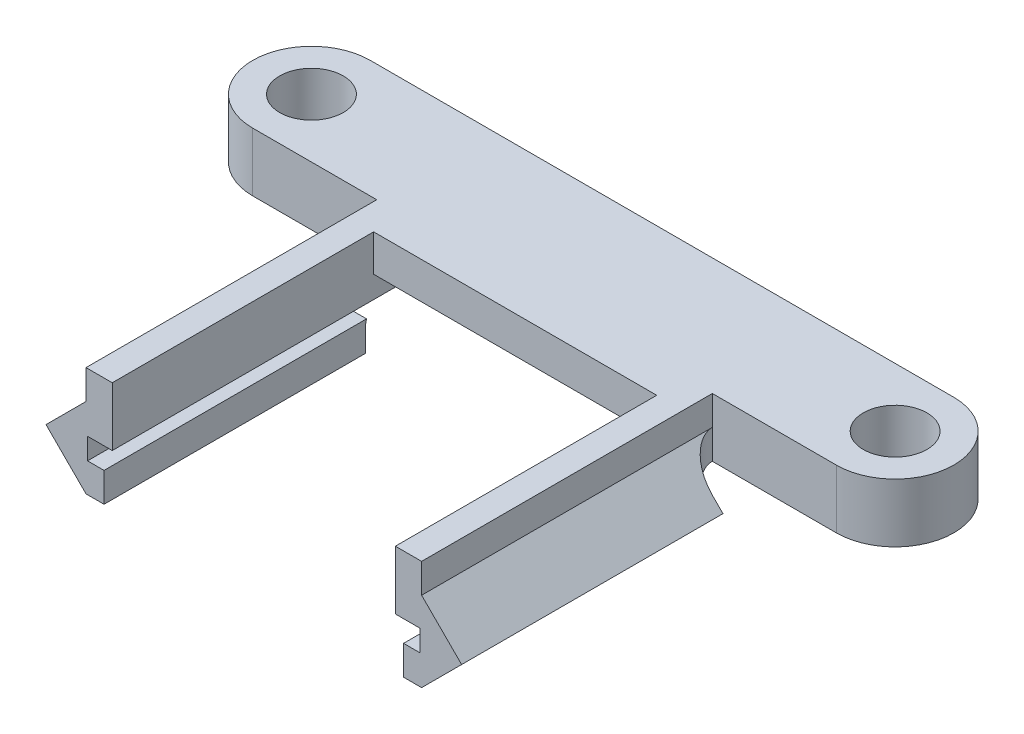
ISO-10303-21;
HEADER;
FILE_DESCRIPTION(('STEP AP214'),'2;1');
FILE_NAME('part.step','',(''),(''),'','','');
FILE_SCHEMA(('AUTOMOTIVE_DESIGN { 1 0 10303 214 1 1 1 1 }'));
ENDSEC;
DATA;
#1=APPLICATION_CONTEXT('core data for automotive mechanical design processes');
#2=APPLICATION_PROTOCOL_DEFINITION('international standard','automotive_design',2000,#1);
#3=PRODUCT_CONTEXT('',#1,'mechanical');
#4=PRODUCT('Part','Part','',(#3));
#5=PRODUCT_RELATED_PRODUCT_CATEGORY('part','',(#4));
#6=PRODUCT_DEFINITION_FORMATION('','',#4);
#7=PRODUCT_DEFINITION_CONTEXT('part definition',#1,'design');
#8=PRODUCT_DEFINITION('design','',#6,#7);
#9=PRODUCT_DEFINITION_SHAPE('','',#8);
#10=(LENGTH_UNIT() NAMED_UNIT(*) SI_UNIT(.MILLI.,.METRE.));
#11=(NAMED_UNIT(*) PLANE_ANGLE_UNIT() SI_UNIT($,.RADIAN.));
#12=(NAMED_UNIT(*) SI_UNIT($,.STERADIAN.) SOLID_ANGLE_UNIT());
#13=UNCERTAINTY_MEASURE_WITH_UNIT(LENGTH_MEASURE(1.E-05),#10,'distance_accuracy_value','');
#14=(GEOMETRIC_REPRESENTATION_CONTEXT(3) GLOBAL_UNCERTAINTY_ASSIGNED_CONTEXT((#13)) GLOBAL_UNIT_ASSIGNED_CONTEXT((#10,
#11,#12)) REPRESENTATION_CONTEXT('',''));
#15=CARTESIAN_POINT('',(0.,0.,0.));
#16=DIRECTION('',(0.,0.,1.));
#17=DIRECTION('',(1.,0.,0.));
#18=AXIS2_PLACEMENT_3D('',#15,#16,#17);
#19=CARTESIAN_POINT('',(0.,1.8415,22.606));
#20=DIRECTION('',(0.,-1.,0.));
#21=DIRECTION('',(0.,0.,-1.));
#22=AXIS2_PLACEMENT_3D('',#19,#20,#21);
#23=PLANE('',#22);
#24=DIRECTION('',(0.,0.,-1.));
#25=VECTOR('',#24,1.);
#26=CARTESIAN_POINT('',(25.7048,1.8415,22.606));
#27=LINE('',#26,#25);
#28=CARTESIAN_POINT('',(25.7048,1.8415,22.606));
#29=VERTEX_POINT('',#28);
#30=CARTESIAN_POINT('',(25.7048,1.8415,-12.7));
#31=VERTEX_POINT('',#30);
#32=EDGE_CURVE('E356',#29,#31,#27,.T.);
#33=ORIENTED_EDGE('',*,*,#32,.T.);
#34=DIRECTION('',(-1.,0.,0.));
#35=VECTOR('',#34,1.);
#36=CARTESIAN_POINT('',(27.84475,1.8415,-12.7));
#37=LINE('',#36,#35);
#38=CARTESIAN_POINT('',(38.70198,1.8415,-12.7));
#39=VERTEX_POINT('',#38);
#40=EDGE_CURVE('E367',#39,#31,#37,.T.);
#41=ORIENTED_EDGE('',*,*,#40,.F.);
#42=CARTESIAN_POINT('',(38.70198,1.8415,-7.61999999999999));
#43=DIRECTION('',(0.,-1.,0.));
#44=DIRECTION('',(0.,0.,-1.));
#45=AXIS2_PLACEMENT_3D('',#42,#43,#44);
#46=CIRCLE('',#45,5.07999999999999);
#47=CARTESIAN_POINT('',(38.70198,1.8415,-2.54));
#48=VERTEX_POINT('',#47);
#49=EDGE_CURVE('E335',#39,#48,#46,.T.);
#50=ORIENTED_EDGE('',*,*,#49,.T.);
#51=DIRECTION('',(-1.,0.,0.));
#52=VECTOR('',#51,1.);
#53=CARTESIAN_POINT('',(27.9761024484277,1.8415,-2.54));
#54=LINE('',#53,#52);
#55=CARTESIAN_POINT('',(27.9761024484277,1.8415,-2.54));
#56=VERTEX_POINT('',#55);
#57=EDGE_CURVE('E257',#48,#56,#54,.T.);
#58=ORIENTED_EDGE('',*,*,#57,.T.);
#59=DIRECTION('',(-1.,0.,0.));
#60=VECTOR('',#59,1.);
#61=CARTESIAN_POINT('',(27.84475,1.8415,-2.54));
#62=LINE('',#61,#60);
#63=CARTESIAN_POINT('',(27.84475,1.8415,-2.53999999999999));
#64=VERTEX_POINT('',#63);
#65=EDGE_CURVE('E449',#56,#64,#62,.T.);
#66=ORIENTED_EDGE('',*,*,#65,.T.);
#67=DIRECTION('',(0.,0.,-1.));
#68=VECTOR('',#67,1.);
#69=CARTESIAN_POINT('',(27.84475,1.8415,22.606));
#70=LINE('',#69,#68);
#71=CARTESIAN_POINT('',(27.84475,1.8415,22.606));
#72=VERTEX_POINT('',#71);
#73=EDGE_CURVE('E403',#72,#64,#70,.T.);
#74=ORIENTED_EDGE('',*,*,#73,.F.);
#75=DIRECTION('',(-1.,0.,0.));
#76=VECTOR('',#75,1.);
#77=CARTESIAN_POINT('',(26.924,1.8415,22.606));
#78=LINE('',#77,#76);
#79=EDGE_CURVE('E394',#72,#29,#78,.T.);
#80=ORIENTED_EDGE('',*,*,#79,.T.);
#81=EDGE_LOOP('',(#33,#41,#50,#58,#66,#74,#80));
#82=FACE_BOUND('',#81,.T.);
#83=CARTESIAN_POINT('',(38.70198,1.8415,-7.61999999999999));
#84=DIRECTION('',(0.,-1.,0.));
#85=DIRECTION('',(0.,0.,-1.));
#86=AXIS2_PLACEMENT_3D('',#83,#84,#85);
#87=CIRCLE('',#86,2.75);
#88=CARTESIAN_POINT('',(38.70198,1.8415,-10.37));
#89=VERTEX_POINT('',#88);
#90=EDGE_CURVE('E316',#89,#89,#87,.T.);
#91=ORIENTED_EDGE('',*,*,#90,.F.);
#92=EDGE_LOOP('',(#91));
#93=FACE_BOUND('',#92,.T.);
#94=ADVANCED_FACE('F34',(#82,#93),#23,.T.);
#95=CARTESIAN_POINT('',(0.,0.,0.));
#96=DIRECTION('',(0.,0.,-1.));
#97=DIRECTION('',(-1.,0.,0.));
#98=AXIS2_PLACEMENT_3D('',#95,#96,#97);
#99=PLANE('',#98);
#100=DIRECTION('',(0.,1.,0.));
#101=VECTOR('',#100,1.);
#102=CARTESIAN_POINT('',(26.416,0.,0.));
#103=LINE('',#102,#101);
#104=CARTESIAN_POINT('',(26.416,-2.54,0.));
#105=VERTEX_POINT('',#104);
#106=CARTESIAN_POINT('',(26.416,-0.6985,0.));
#107=VERTEX_POINT('',#106);
#108=EDGE_CURVE('E373',#105,#107,#103,.T.);
#109=ORIENTED_EDGE('',*,*,#108,.T.);
#110=DIRECTION('',(-1.,0.,0.));
#111=VECTOR('',#110,1.);
#112=CARTESIAN_POINT('',(27.9761024484277,-0.6985,0.));
#113=LINE('',#112,#111);
#114=CARTESIAN_POINT('',(29.8176024484277,-0.6985,0.));
#115=VERTEX_POINT('',#114);
#116=EDGE_CURVE('E463',#107,#115,#113,.F.);
#117=ORIENTED_EDGE('',*,*,#116,.T.);
#118=DIRECTION('',(0.707106781186548,0.707106781186547,0.));
#119=VECTOR('',#118,1.);
#120=CARTESIAN_POINT('',(27.9761024484277,-2.54,0.));
#121=LINE('',#120,#119);
#122=CARTESIAN_POINT('',(27.9761024484277,-2.54,0.));
#123=VERTEX_POINT('',#122);
#124=EDGE_CURVE('E411',#123,#115,#121,.T.);
#125=ORIENTED_EDGE('',*,*,#124,.F.);
#126=DIRECTION('',(1.,0.,0.));
#127=VECTOR('',#126,1.);
#128=CARTESIAN_POINT('',(26.0985,-2.54,0.));
#129=LINE('',#128,#127);
#130=EDGE_CURVE('E426',#105,#123,#129,.T.);
#131=ORIENTED_EDGE('',*,*,#130,.F.);
#132=EDGE_LOOP('',(#109,#117,#125,#131));
#133=FACE_BOUND('',#132,.T.);
#134=ADVANCED_FACE('F541',(#133),#99,.T.);
#135=DIRECTION('',(0.707106781186548,-0.707106781186547,0.));
#136=VECTOR('',#135,1.);
#137=CARTESIAN_POINT('',(-1.05210244842766,-2.54,0.));
#138=LINE('',#137,#136);
#139=CARTESIAN_POINT('',(-2.89360244842766,-0.6985,0.));
#140=VERTEX_POINT('',#139);
#141=CARTESIAN_POINT('',(-1.05210244842766,-2.54,0.));
#142=VERTEX_POINT('',#141);
#143=EDGE_CURVE('E406',#140,#142,#138,.T.);
#144=ORIENTED_EDGE('',*,*,#143,.F.);
#145=DIRECTION('',(-1.,0.,0.));
#146=VECTOR('',#145,1.);
#147=CARTESIAN_POINT('',(-0.920750000000008,-0.6985,0.));
#148=LINE('',#147,#146);
#149=CARTESIAN_POINT('',(0.507999999999999,-0.6985,0.));
#150=VERTEX_POINT('',#149);
#151=EDGE_CURVE('E457',#140,#150,#148,.F.);
#152=ORIENTED_EDGE('',*,*,#151,.T.);
#153=DIRECTION('',(0.,-1.,0.));
#154=VECTOR('',#153,1.);
#155=CARTESIAN_POINT('',(0.508,0.,0.));
#156=LINE('',#155,#154);
#157=CARTESIAN_POINT('',(0.507999999999998,-2.54,0.));
#158=VERTEX_POINT('',#157);
#159=EDGE_CURVE('E371',#150,#158,#156,.T.);
#160=ORIENTED_EDGE('',*,*,#159,.T.);
#161=EDGE_CURVE('E427',#142,#158,#129,.T.);
#162=ORIENTED_EDGE('',*,*,#161,.F.);
#163=EDGE_LOOP('',(#144,#152,#160,#162));
#164=FACE_BOUND('',#163,.T.);
#165=ADVANCED_FACE('F627',(#164),#99,.T.);
#166=CARTESIAN_POINT('',(31.4368524484277,0.920749999999997,22.606));
#167=DIRECTION('',(-0.707106781186548,-0.707106781186547,0.));
#168=DIRECTION('',(0.707106781186547,-0.707106781186548,0.));
#169=AXIS2_PLACEMENT_3D('',#166,#167,#168);
#170=PLANE('',#169);
#171=DIRECTION('',(-0.707106781186547,0.707106781186548,0.));
#172=VECTOR('',#171,1.);
#173=CARTESIAN_POINT('',(27.9761024484277,4.3815,0.));
#174=LINE('',#173,#172);
#175=CARTESIAN_POINT('',(31.4368524484277,0.920749999999997,0.));
#176=VERTEX_POINT('',#175);
#177=CARTESIAN_POINT('',(30.5161024484277,1.8415,0.));
#178=VERTEX_POINT('',#177);
#179=EDGE_CURVE('E347',#176,#178,#174,.T.);
#180=ORIENTED_EDGE('',*,*,#179,.T.);
#181=CARTESIAN_POINT('',(30.5161024484277,1.8415,-2.54));
#182=DIRECTION('',(-0.707106781186548,-0.707106781186547,0.));
#183=DIRECTION('',(0.707106781186547,-0.707106781186548,0.));
#184=AXIS2_PLACEMENT_3D('',#181,#182,#183);
#185=ELLIPSE('',#184,3.59210244842766,2.54);
#186=CARTESIAN_POINT('',(27.9761024484277,4.3815,-2.54));
#187=VERTEX_POINT('',#186);
#188=EDGE_CURVE('E12',#178,#187,#185,.T.);
#189=ORIENTED_EDGE('',*,*,#188,.T.);
#190=DIRECTION('',(0.,0.,-1.));
#191=VECTOR('',#190,1.);
#192=CARTESIAN_POINT('',(27.9761024484277,4.3815,22.606));
#193=LINE('',#192,#191);
#194=CARTESIAN_POINT('',(27.9761024484277,4.3815,22.606));
#195=VERTEX_POINT('',#194);
#196=EDGE_CURVE('E438',#195,#187,#193,.T.);
#197=ORIENTED_EDGE('',*,*,#196,.F.);
#198=DIRECTION('',(-0.707106781186547,0.707106781186548,0.));
#199=VECTOR('',#198,1.);
#200=CARTESIAN_POINT('',(31.4368524484277,0.920749999999997,22.606));
#201=LINE('',#200,#199);
#202=CARTESIAN_POINT('',(31.4368524484277,0.920749999999997,22.606));
#203=VERTEX_POINT('',#202);
#204=EDGE_CURVE('E417',#203,#195,#201,.T.);
#205=ORIENTED_EDGE('',*,*,#204,.F.);
#206=DIRECTION('',(0.,0.,-1.));
#207=VECTOR('',#206,1.);
#208=CARTESIAN_POINT('',(31.4368524484277,0.920749999999997,22.606));
#209=LINE('',#208,#207);
#210=EDGE_CURVE('E440',#203,#176,#209,.T.);
#211=ORIENTED_EDGE('',*,*,#210,.T.);
#212=EDGE_LOOP('',(#180,#189,#197,#205,#211));
#213=FACE_BOUND('',#212,.T.);
#214=ADVANCED_FACE('F528',(#213),#170,.F.);
#215=CARTESIAN_POINT('',(-4.51285244842766,0.920749999999996,22.606));
#216=DIRECTION('',(0.707106781186548,-0.707106781186547,0.));
#217=DIRECTION('',(0.707106781186547,0.707106781186548,0.));
#218=AXIS2_PLACEMENT_3D('',#215,#216,#217);
#219=PLANE('',#218);
#220=DIRECTION('',(0.,0.,-1.));
#221=VECTOR('',#220,1.);
#222=CARTESIAN_POINT('',(-1.05210244842766,4.3815,22.606));
#223=LINE('',#222,#221);
#224=CARTESIAN_POINT('',(-1.05210244842766,4.3815,22.606));
#225=VERTEX_POINT('',#224);
#226=CARTESIAN_POINT('',(-1.05210244842767,4.3815,-2.53999999999999));
#227=VERTEX_POINT('',#226);
#228=EDGE_CURVE('E435',#225,#227,#223,.T.);
#229=ORIENTED_EDGE('',*,*,#228,.T.);
#230=CARTESIAN_POINT('',(-3.59210244842767,1.84149999999999,-2.54));
#231=DIRECTION('',(0.707106781186548,-0.707106781186547,0.));
#232=DIRECTION('',(0.707106781186547,0.707106781186548,0.));
#233=AXIS2_PLACEMENT_3D('',#230,#231,#232);
#234=ELLIPSE('',#233,3.59210244842766,2.54);
#235=CARTESIAN_POINT('',(-3.59210244842767,1.8415,0.));
#236=VERTEX_POINT('',#235);
#237=EDGE_CURVE('E479',#227,#236,#234,.T.);
#238=ORIENTED_EDGE('',*,*,#237,.T.);
#239=DIRECTION('',(-0.707106781186547,-0.707106781186548,0.));
#240=VECTOR('',#239,1.);
#241=CARTESIAN_POINT('',(-1.05210244842767,4.3815,0.));
#242=LINE('',#241,#240);
#243=CARTESIAN_POINT('',(-4.51285244842766,0.920750000000001,0.));
#244=VERTEX_POINT('',#243);
#245=EDGE_CURVE('E351',#236,#244,#242,.T.);
#246=ORIENTED_EDGE('',*,*,#245,.T.);
#247=DIRECTION('',(0.,0.,-1.));
#248=VECTOR('',#247,1.);
#249=CARTESIAN_POINT('',(-4.51285244842766,0.920749999999996,22.606));
#250=LINE('',#249,#248);
#251=CARTESIAN_POINT('',(-4.51285244842766,0.920749999999996,22.606));
#252=VERTEX_POINT('',#251);
#253=EDGE_CURVE('E422',#252,#244,#250,.T.);
#254=ORIENTED_EDGE('',*,*,#253,.F.);
#255=DIRECTION('',(-0.707106781186547,-0.707106781186548,0.));
#256=VECTOR('',#255,1.);
#257=CARTESIAN_POINT('',(-4.51285244842766,0.920749999999996,22.606));
#258=LINE('',#257,#256);
#259=EDGE_CURVE('E420',#225,#252,#258,.T.);
#260=ORIENTED_EDGE('',*,*,#259,.F.);
#261=EDGE_LOOP('',(#229,#238,#246,#254,#260));
#262=FACE_BOUND('',#261,.T.);
#263=ADVANCED_FACE('F579',(#262),#219,.F.);
#264=CARTESIAN_POINT('',(27.84475,1.8415,22.606));
#265=DIRECTION('',(-1.,0.,0.));
#266=DIRECTION('',(0.,0.,1.));
#267=AXIS2_PLACEMENT_3D('',#264,#265,#266);
#268=PLANE('',#267);
#269=ORIENTED_EDGE('',*,*,#73,.T.);
#270=CARTESIAN_POINT('',(27.84475,-0.6985,-2.54));
#271=DIRECTION('',(-1.,0.,0.));
#272=DIRECTION('',(0.,0.,1.));
#273=AXIS2_PLACEMENT_3D('',#270,#271,#272);
#274=CIRCLE('',#273,2.54);
#275=CARTESIAN_POINT('',(27.84475,0.,-0.0979316655752571));
#276=VERTEX_POINT('',#275);
#277=EDGE_CURVE('E483',#64,#276,#274,.F.);
#278=ORIENTED_EDGE('',*,*,#277,.T.);
#279=DIRECTION('',(0.,0.,-1.));
#280=VECTOR('',#279,1.);
#281=CARTESIAN_POINT('',(27.84475,0.,22.606));
#282=LINE('',#281,#280);
#283=CARTESIAN_POINT('',(27.84475,0.,22.606));
#284=VERTEX_POINT('',#283);
#285=EDGE_CURVE('E58',#284,#276,#282,.T.);
#286=ORIENTED_EDGE('',*,*,#285,.F.);
#287=DIRECTION('',(0.,1.,0.));
#288=VECTOR('',#287,1.);
#289=CARTESIAN_POINT('',(27.84475,1.8415,22.606));
#290=LINE('',#289,#288);
#291=EDGE_CURVE('E391',#284,#72,#290,.T.);
#292=ORIENTED_EDGE('',*,*,#291,.T.);
#293=EDGE_LOOP('',(#269,#278,#286,#292));
#294=FACE_BOUND('',#293,.T.);
#295=ADVANCED_FACE('F556',(#294),#268,.T.);
#296=CARTESIAN_POINT('',(-0.920750000000006,1.8415,22.606));
#297=DIRECTION('',(1.,0.,0.));
#298=DIRECTION('',(0.,0.,-1.));
#299=AXIS2_PLACEMENT_3D('',#296,#297,#298);
#300=PLANE('',#299);
#301=DIRECTION('',(0.,0.,-1.));
#302=VECTOR('',#301,1.);
#303=CARTESIAN_POINT('',(-0.920750000000006,0.,22.606));
#304=LINE('',#303,#302);
#305=CARTESIAN_POINT('',(-0.920750000000006,0.,22.606));
#306=VERTEX_POINT('',#305);
#307=CARTESIAN_POINT('',(-0.920750000000006,0.,-0.0979316655752571));
#308=VERTEX_POINT('',#307);
#309=EDGE_CURVE('E399',#306,#308,#304,.T.);
#310=ORIENTED_EDGE('',*,*,#309,.T.);
#311=CARTESIAN_POINT('',(-0.920750000000006,-0.6985,-2.54));
#312=DIRECTION('',(1.,0.,0.));
#313=DIRECTION('',(0.,0.,-1.));
#314=AXIS2_PLACEMENT_3D('',#311,#312,#313);
#315=CIRCLE('',#314,2.54);
#316=CARTESIAN_POINT('',(-0.920750000000006,1.8415,-2.53999999999999));
#317=VERTEX_POINT('',#316);
#318=EDGE_CURVE('E476',#308,#317,#315,.F.);
#319=ORIENTED_EDGE('',*,*,#318,.T.);
#320=DIRECTION('',(0.,0.,-1.));
#321=VECTOR('',#320,1.);
#322=CARTESIAN_POINT('',(-0.920750000000006,1.8415,22.606));
#323=LINE('',#322,#321);
#324=CARTESIAN_POINT('',(-0.920750000000006,1.8415,22.606));
#325=VERTEX_POINT('',#324);
#326=EDGE_CURVE('E401',#325,#317,#323,.T.);
#327=ORIENTED_EDGE('',*,*,#326,.F.);
#328=DIRECTION('',(0.,-1.,0.));
#329=VECTOR('',#328,1.);
#330=CARTESIAN_POINT('',(-0.920750000000006,1.8415,22.606));
#331=LINE('',#330,#329);
#332=EDGE_CURVE('E397',#325,#306,#331,.T.);
#333=ORIENTED_EDGE('',*,*,#332,.T.);
#334=EDGE_LOOP('',(#310,#319,#327,#333));
#335=FACE_BOUND('',#334,.T.);
#336=ADVANCED_FACE('F606',(#335),#300,.T.);
#337=CARTESIAN_POINT('',(0.,0.,22.606));
#338=DIRECTION('',(0.,0.,-1.));
#339=DIRECTION('',(-1.,0.,0.));
#340=AXIS2_PLACEMENT_3D('',#337,#338,#339);
#341=PLANE('',#340);
#342=CARTESIAN_POINT('',(1.2192,1.8415,22.606));
#343=VERTEX_POINT('',#342);
#344=EDGE_CURVE('E393',#343,#325,#78,.T.);
#345=ORIENTED_EDGE('',*,*,#344,.F.);
#346=DIRECTION('',(0.,1.,0.));
#347=VECTOR('',#346,1.);
#348=CARTESIAN_POINT('',(1.2192,1.8415,22.606));
#349=LINE('',#348,#347);
#350=CARTESIAN_POINT('',(1.2192,6.9215,22.606));
#351=VERTEX_POINT('',#350);
#352=EDGE_CURVE('E358',#343,#351,#349,.T.);
#353=ORIENTED_EDGE('',*,*,#352,.T.);
#354=DIRECTION('',(1.,0.,0.));
#355=VECTOR('',#354,1.);
#356=CARTESIAN_POINT('',(-1.05210244842766,6.9215,22.606));
#357=LINE('',#356,#355);
#358=CARTESIAN_POINT('',(-1.05210244842766,6.9215,22.606));
#359=VERTEX_POINT('',#358);
#360=EDGE_CURVE('E282',#359,#351,#357,.T.);
#361=ORIENTED_EDGE('',*,*,#360,.F.);
#362=DIRECTION('',(0.,-1.,0.));
#363=VECTOR('',#362,1.);
#364=CARTESIAN_POINT('',(-1.05210244842766,6.9215,22.606));
#365=LINE('',#364,#363);
#366=EDGE_CURVE('E309',#359,#225,#365,.T.);
#367=ORIENTED_EDGE('',*,*,#366,.T.);
#368=ORIENTED_EDGE('',*,*,#259,.T.);
#369=DIRECTION('',(0.707106781186548,-0.707106781186547,0.));
#370=VECTOR('',#369,1.);
#371=CARTESIAN_POINT('',(-1.05210244842766,-2.54,22.606));
#372=LINE('',#371,#370);
#373=CARTESIAN_POINT('',(-1.05210244842766,-2.54,22.606));
#374=VERTEX_POINT('',#373);
#375=EDGE_CURVE('E407',#252,#374,#372,.T.);
#376=ORIENTED_EDGE('',*,*,#375,.T.);
#377=DIRECTION('',(1.,0.,0.));
#378=VECTOR('',#377,1.);
#379=CARTESIAN_POINT('',(0.825500000000002,-2.54,22.606));
#380=LINE('',#379,#378);
#381=CARTESIAN_POINT('',(0.507999999999998,-2.54,22.606));
#382=VERTEX_POINT('',#381);
#383=EDGE_CURVE('E412',#374,#382,#380,.T.);
#384=ORIENTED_EDGE('',*,*,#383,.T.);
#385=DIRECTION('',(0.,-1.,0.));
#386=VECTOR('',#385,1.);
#387=CARTESIAN_POINT('',(0.508,0.,22.606));
#388=LINE('',#387,#386);
#389=CARTESIAN_POINT('',(0.508,0.,22.606));
#390=VERTEX_POINT('',#389);
#391=EDGE_CURVE('E370',#390,#382,#388,.T.);
#392=ORIENTED_EDGE('',*,*,#391,.F.);
#393=DIRECTION('',(1.,0.,0.));
#394=VECTOR('',#393,1.);
#395=CARTESIAN_POINT('',(-0.920750000000006,0.,22.606));
#396=LINE('',#395,#394);
#397=EDGE_CURVE('E388',#306,#390,#396,.T.);
#398=ORIENTED_EDGE('',*,*,#397,.F.);
#399=ORIENTED_EDGE('',*,*,#332,.F.);
#400=EDGE_LOOP('',(#345,#353,#361,#367,#368,#376,#384,#392,#398,#399));
#401=FACE_BOUND('',#400,.T.);
#402=ADVANCED_FACE('F587',(#401),#341,.F.);
#403=ORIENTED_EDGE('',*,*,#245,.F.);
#404=DIRECTION('',(0.,1.,0.));
#405=VECTOR('',#404,1.);
#406=CARTESIAN_POINT('',(-3.59210244842767,0.,0.));
#407=LINE('',#406,#405);
#408=CARTESIAN_POINT('',(-3.59210244842767,0.,0.));
#409=VERTEX_POINT('',#408);
#410=EDGE_CURVE('E455',#236,#409,#407,.F.);
#411=ORIENTED_EDGE('',*,*,#410,.T.);
#412=EDGE_CURVE('E423',#244,#409,#138,.T.);
#413=ORIENTED_EDGE('',*,*,#412,.F.);
#414=EDGE_LOOP('',(#403,#411,#413));
#415=FACE_BOUND('',#414,.T.);
#416=ADVANCED_FACE('F650',(#415),#99,.T.);
#417=CARTESIAN_POINT('',(26.0985,-2.54,22.606));
#418=DIRECTION('',(0.,1.,0.));
#419=DIRECTION('',(0.,0.,1.));
#420=AXIS2_PLACEMENT_3D('',#417,#418,#419);
#421=PLANE('',#420);
#422=ORIENTED_EDGE('',*,*,#161,.T.);
#423=DIRECTION('',(0.,0.,1.));
#424=VECTOR('',#423,1.);
#425=CARTESIAN_POINT('',(0.507999999999998,-2.54,0.));
#426=LINE('',#425,#424);
#427=EDGE_CURVE('E377',#158,#382,#426,.T.);
#428=ORIENTED_EDGE('',*,*,#427,.T.);
#429=ORIENTED_EDGE('',*,*,#383,.F.);
#430=DIRECTION('',(0.,0.,-1.));
#431=VECTOR('',#430,1.);
#432=CARTESIAN_POINT('',(-1.05210244842766,-2.54,22.606));
#433=LINE('',#432,#431);
#434=EDGE_CURVE('E446',#374,#142,#433,.T.);
#435=ORIENTED_EDGE('',*,*,#434,.T.);
#436=EDGE_LOOP('',(#422,#428,#429,#435));
#437=FACE_BOUND('',#436,.T.);
#438=ADVANCED_FACE('F645',(#437),#421,.F.);
#439=CARTESIAN_POINT('',(27.84475,0.,22.606));
#440=DIRECTION('',(0.,1.,0.));
#441=DIRECTION('',(0.,0.,1.));
#442=AXIS2_PLACEMENT_3D('',#439,#440,#441);
#443=PLANE('',#442);
#444=DIRECTION('',(0.,0.,1.));
#445=VECTOR('',#444,1.);
#446=CARTESIAN_POINT('',(0.508,0.,0.));
#447=LINE('',#446,#445);
#448=CARTESIAN_POINT('',(0.508,0.,-0.0979316655752647));
#449=VERTEX_POINT('',#448);
#450=EDGE_CURVE('E380',#449,#390,#447,.T.);
#451=ORIENTED_EDGE('',*,*,#450,.F.);
#452=DIRECTION('',(1.,0.,0.));
#453=VECTOR('',#452,1.);
#454=CARTESIAN_POINT('',(0.508,0.,-0.0979316655752648));
#455=LINE('',#454,#453);
#456=EDGE_CURVE('E473',#449,#308,#455,.F.);
#457=ORIENTED_EDGE('',*,*,#456,.T.);
#458=ORIENTED_EDGE('',*,*,#309,.F.);
#459=ORIENTED_EDGE('',*,*,#397,.T.);
#460=EDGE_LOOP('',(#451,#457,#458,#459));
#461=FACE_BOUND('',#460,.T.);
#462=ADVANCED_FACE('F608',(#461),#443,.T.);
#463=ORIENTED_EDGE('',*,*,#204,.T.);
#464=DIRECTION('',(0.,-1.,0.));
#465=VECTOR('',#464,1.);
#466=CARTESIAN_POINT('',(27.9761024484277,6.9215,22.606));
#467=LINE('',#466,#465);
#468=CARTESIAN_POINT('',(27.9761024484277,6.9215,22.606));
#469=VERTEX_POINT('',#468);
#470=EDGE_CURVE('E307',#469,#195,#467,.T.);
#471=ORIENTED_EDGE('',*,*,#470,.F.);
#472=DIRECTION('',(1.,0.,0.));
#473=VECTOR('',#472,1.);
#474=CARTESIAN_POINT('',(25.7048,6.9215,22.606));
#475=LINE('',#474,#473);
#476=CARTESIAN_POINT('',(25.7048,6.9215,22.606));
#477=VERTEX_POINT('',#476);
#478=EDGE_CURVE('E294',#477,#469,#475,.T.);
#479=ORIENTED_EDGE('',*,*,#478,.F.);
#480=DIRECTION('',(0.,1.,0.));
#481=VECTOR('',#480,1.);
#482=CARTESIAN_POINT('',(25.7048,1.8415,22.606));
#483=LINE('',#482,#481);
#484=EDGE_CURVE('E364',#29,#477,#483,.T.);
#485=ORIENTED_EDGE('',*,*,#484,.F.);
#486=ORIENTED_EDGE('',*,*,#79,.F.);
#487=ORIENTED_EDGE('',*,*,#291,.F.);
#488=CARTESIAN_POINT('',(26.416,0.,22.606));
#489=VERTEX_POINT('',#488);
#490=EDGE_CURVE('E382',#489,#284,#396,.T.);
#491=ORIENTED_EDGE('',*,*,#490,.F.);
#492=DIRECTION('',(0.,1.,0.));
#493=VECTOR('',#492,1.);
#494=CARTESIAN_POINT('',(26.416,0.,22.606));
#495=LINE('',#494,#493);
#496=CARTESIAN_POINT('',(26.416,-2.54,22.606));
#497=VERTEX_POINT('',#496);
#498=EDGE_CURVE('E374',#497,#489,#495,.T.);
#499=ORIENTED_EDGE('',*,*,#498,.F.);
#500=CARTESIAN_POINT('',(27.9761024484277,-2.54,22.606));
#501=VERTEX_POINT('',#500);
#502=EDGE_CURVE('E410',#497,#501,#380,.T.);
#503=ORIENTED_EDGE('',*,*,#502,.T.);
#504=DIRECTION('',(0.707106781186548,0.707106781186547,0.));
#505=VECTOR('',#504,1.);
#506=CARTESIAN_POINT('',(27.9761024484277,-2.54,22.606));
#507=LINE('',#506,#505);
#508=EDGE_CURVE('E415',#501,#203,#507,.T.);
#509=ORIENTED_EDGE('',*,*,#508,.T.);
#510=EDGE_LOOP('',(#463,#471,#479,#485,#486,#487,#491,#499,#503,#509));
#511=FACE_BOUND('',#510,.T.);
#512=ADVANCED_FACE('F551',(#511),#341,.F.);
#513=CARTESIAN_POINT('',(30.5161024484277,0.,0.));
#514=VERTEX_POINT('',#513);
#515=EDGE_CURVE('E430',#514,#176,#121,.T.);
#516=ORIENTED_EDGE('',*,*,#515,.F.);
#517=DIRECTION('',(0.,-1.,0.));
#518=VECTOR('',#517,1.);
#519=CARTESIAN_POINT('',(30.5161024484277,0.,0.));
#520=LINE('',#519,#518);
#521=EDGE_CURVE('E461',#514,#178,#520,.F.);
#522=ORIENTED_EDGE('',*,*,#521,.T.);
#523=ORIENTED_EDGE('',*,*,#179,.F.);
#524=EDGE_LOOP('',(#516,#522,#523));
#525=FACE_BOUND('',#524,.T.);
#526=ADVANCED_FACE('F532',(#525),#99,.T.);
#527=CARTESIAN_POINT('',(-1.05210244842766,-2.54,22.606));
#528=DIRECTION('',(0.707106781186547,0.707106781186548,0.));
#529=DIRECTION('',(-0.707106781186548,0.707106781186547,0.));
#530=AXIS2_PLACEMENT_3D('',#527,#528,#529);
#531=PLANE('',#530);
#532=ORIENTED_EDGE('',*,*,#412,.T.);
#533=CARTESIAN_POINT('',(-3.59210244842767,0.,-2.54));
#534=DIRECTION('',(0.707106781186547,0.707106781186548,0.));
#535=DIRECTION('',(-0.707106781186548,0.707106781186547,0.));
#536=AXIS2_PLACEMENT_3D('',#533,#534,#535);
#537=ELLIPSE('',#536,3.59210244842766,2.54);
#538=CARTESIAN_POINT('',(-3.24285244842766,-0.349249999999998,-0.024125512371494));
#539=VERTEX_POINT('',#538);
#540=EDGE_CURVE('E481',#409,#539,#537,.T.);
#541=ORIENTED_EDGE('',*,*,#540,.T.);
#542=CARTESIAN_POINT('',(-2.89360244842766,-0.6985,-2.54));
#543=DIRECTION('',(0.707106781186547,0.707106781186548,0.));
#544=DIRECTION('',(0.707106781186548,-0.707106781186547,0.));
#545=AXIS2_PLACEMENT_3D('',#542,#543,#544);
#546=ELLIPSE('',#545,3.59210244842766,2.54);
#547=EDGE_CURVE('E468',#539,#140,#546,.T.);
#548=ORIENTED_EDGE('',*,*,#547,.T.);
#549=ORIENTED_EDGE('',*,*,#143,.T.);
#550=ORIENTED_EDGE('',*,*,#434,.F.);
#551=ORIENTED_EDGE('',*,*,#375,.F.);
#552=ORIENTED_EDGE('',*,*,#253,.T.);
#553=EDGE_LOOP('',(#532,#541,#548,#549,#550,#551,#552));
#554=FACE_BOUND('',#553,.T.);
#555=ADVANCED_FACE('F658',(#554),#531,.F.);
#556=ORIENTED_EDGE('',*,*,#502,.F.);
#557=DIRECTION('',(0.,0.,1.));
#558=VECTOR('',#557,1.);
#559=CARTESIAN_POINT('',(26.416,-2.54,0.));
#560=LINE('',#559,#558);
#561=EDGE_CURVE('E384',#105,#497,#560,.T.);
#562=ORIENTED_EDGE('',*,*,#561,.F.);
#563=ORIENTED_EDGE('',*,*,#130,.T.);
#564=DIRECTION('',(0.,0.,-1.));
#565=VECTOR('',#564,1.);
#566=CARTESIAN_POINT('',(27.9761024484277,-2.54,22.606));
#567=LINE('',#566,#565);
#568=EDGE_CURVE('E443',#501,#123,#567,.T.);
#569=ORIENTED_EDGE('',*,*,#568,.F.);
#570=EDGE_LOOP('',(#556,#562,#563,#569));
#571=FACE_BOUND('',#570,.T.);
#572=ADVANCED_FACE('F549',(#571),#421,.F.);
#573=CARTESIAN_POINT('',(27.9761024484277,-2.54,22.606));
#574=DIRECTION('',(-0.707106781186547,0.707106781186548,0.));
#575=DIRECTION('',(-0.707106781186548,-0.707106781186547,0.));
#576=AXIS2_PLACEMENT_3D('',#573,#574,#575);
#577=PLANE('',#576);
#578=ORIENTED_EDGE('',*,*,#124,.T.);
#579=CARTESIAN_POINT('',(29.8176024484277,-0.6985,-2.54));
#580=DIRECTION('',(-0.707106781186547,0.707106781186548,0.));
#581=DIRECTION('',(0.707106781186548,0.707106781186547,0.));
#582=AXIS2_PLACEMENT_3D('',#579,#580,#581);
#583=ELLIPSE('',#582,3.59210244842766,2.54);
#584=CARTESIAN_POINT('',(30.1668524484277,-0.349250000000001,-0.024125512371494));
#585=VERTEX_POINT('',#584);
#586=EDGE_CURVE('E489',#115,#585,#583,.T.);
#587=ORIENTED_EDGE('',*,*,#586,.T.);
#588=CARTESIAN_POINT('',(30.5161024484277,0.,-2.54));
#589=DIRECTION('',(-0.707106781186547,0.707106781186548,0.));
#590=DIRECTION('',(-0.707106781186548,-0.707106781186547,0.));
#591=AXIS2_PLACEMENT_3D('',#588,#589,#590);
#592=ELLIPSE('',#591,3.59210244842766,2.54);
#593=EDGE_CURVE('E43',#585,#514,#592,.T.);
#594=ORIENTED_EDGE('',*,*,#593,.T.);
#595=ORIENTED_EDGE('',*,*,#515,.T.);
#596=ORIENTED_EDGE('',*,*,#210,.F.);
#597=ORIENTED_EDGE('',*,*,#508,.F.);
#598=ORIENTED_EDGE('',*,*,#568,.T.);
#599=EDGE_LOOP('',(#578,#587,#594,#595,#596,#597,#598));
#600=FACE_BOUND('',#599,.T.);
#601=ADVANCED_FACE('F535',(#600),#577,.F.);
#602=DIRECTION('',(0.,0.,1.));
#603=VECTOR('',#602,1.);
#604=CARTESIAN_POINT('',(26.416,0.,0.));
#605=LINE('',#604,#603);
#606=CARTESIAN_POINT('',(26.416,0.,-0.0979316655752647));
#607=VERTEX_POINT('',#606);
#608=EDGE_CURVE('E51',#607,#489,#605,.T.);
#609=ORIENTED_EDGE('',*,*,#608,.T.);
#610=ORIENTED_EDGE('',*,*,#490,.T.);
#611=ORIENTED_EDGE('',*,*,#285,.T.);
#612=DIRECTION('',(1.,0.,0.));
#613=VECTOR('',#612,1.);
#614=CARTESIAN_POINT('',(27.84475,0.,-0.0979316655752648));
#615=LINE('',#614,#613);
#616=EDGE_CURVE('E485',#276,#607,#615,.F.);
#617=ORIENTED_EDGE('',*,*,#616,.T.);
#618=EDGE_LOOP('',(#609,#610,#611,#617));
#619=FACE_BOUND('',#618,.T.);
#620=ADVANCED_FACE('F554',(#619),#443,.T.);
#621=CARTESIAN_POINT('',(1.2192,1.8415,-12.7));
#622=VERTEX_POINT('',#621);
#623=CARTESIAN_POINT('',(-11.77798,1.8415,-12.7));
#624=VERTEX_POINT('',#623);
#625=EDGE_CURVE('E361',#622,#624,#37,.T.);
#626=ORIENTED_EDGE('',*,*,#625,.F.);
#627=DIRECTION('',(0.,0.,1.));
#628=VECTOR('',#627,1.);
#629=CARTESIAN_POINT('',(1.2192,1.8415,0.));
#630=LINE('',#629,#628);
#631=EDGE_CURVE('E350',#622,#343,#630,.T.);
#632=ORIENTED_EDGE('',*,*,#631,.T.);
#633=ORIENTED_EDGE('',*,*,#344,.T.);
#634=ORIENTED_EDGE('',*,*,#326,.T.);
#635=DIRECTION('',(-1.,0.,0.));
#636=VECTOR('',#635,1.);
#637=CARTESIAN_POINT('',(-1.05210244842767,1.8415,-2.54));
#638=LINE('',#637,#636);
#639=CARTESIAN_POINT('',(-1.05210244842767,1.8415,-2.54));
#640=VERTEX_POINT('',#639);
#641=EDGE_CURVE('E452',#317,#640,#638,.T.);
#642=ORIENTED_EDGE('',*,*,#641,.T.);
#643=CARTESIAN_POINT('',(-11.77798,1.8415,-2.54000000000001));
#644=VERTEX_POINT('',#643);
#645=EDGE_CURVE('E338',#640,#644,#54,.T.);
#646=ORIENTED_EDGE('',*,*,#645,.T.);
#647=CARTESIAN_POINT('',(-11.77798,1.8415,-7.62));
#648=DIRECTION('',(0.,-1.,0.));
#649=DIRECTION('',(0.,0.,1.));
#650=AXIS2_PLACEMENT_3D('',#647,#648,#649);
#651=CIRCLE('',#650,5.07999999999999);
#652=EDGE_CURVE('E253',#644,#624,#651,.T.);
#653=ORIENTED_EDGE('',*,*,#652,.T.);
#654=EDGE_LOOP('',(#626,#632,#633,#634,#642,#646,#653));
#655=FACE_BOUND('',#654,.T.);
#656=CARTESIAN_POINT('',(-11.77798,1.8415,-7.62));
#657=DIRECTION('',(0.,-1.,0.));
#658=DIRECTION('',(0.,0.,-1.));
#659=AXIS2_PLACEMENT_3D('',#656,#657,#658);
#660=CIRCLE('',#659,2.75);
#661=CARTESIAN_POINT('',(-11.77798,1.8415,-10.37));
#662=VERTEX_POINT('',#661);
#663=EDGE_CURVE('E331',#662,#662,#660,.T.);
#664=ORIENTED_EDGE('',*,*,#663,.F.);
#665=EDGE_LOOP('',(#664));
#666=FACE_BOUND('',#665,.T.);
#667=ADVANCED_FACE('F569',(#655,#666),#23,.T.);
#668=CARTESIAN_POINT('',(26.416,0.,0.));
#669=DIRECTION('',(1.,0.,0.));
#670=DIRECTION('',(0.,0.,-1.));
#671=AXIS2_PLACEMENT_3D('',#668,#669,#670);
#672=PLANE('',#671);
#673=ORIENTED_EDGE('',*,*,#498,.T.);
#674=ORIENTED_EDGE('',*,*,#608,.F.);
#675=CARTESIAN_POINT('',(26.416,-0.6985,-2.54));
#676=DIRECTION('',(1.,0.,0.));
#677=DIRECTION('',(0.,0.,-1.));
#678=AXIS2_PLACEMENT_3D('',#675,#676,#677);
#679=CIRCLE('',#678,2.54);
#680=EDGE_CURVE('E487',#607,#107,#679,.T.);
#681=ORIENTED_EDGE('',*,*,#680,.T.);
#682=ORIENTED_EDGE('',*,*,#108,.F.);
#683=ORIENTED_EDGE('',*,*,#561,.T.);
#684=EDGE_LOOP('',(#673,#674,#681,#682,#683));
#685=FACE_BOUND('',#684,.T.);
#686=ADVANCED_FACE('F544',(#685),#672,.F.);
#687=CARTESIAN_POINT('',(0.508,0.,0.));
#688=DIRECTION('',(-1.,0.,0.));
#689=DIRECTION('',(0.,-1.,0.));
#690=AXIS2_PLACEMENT_3D('',#687,#688,#689);
#691=PLANE('',#690);
#692=ORIENTED_EDGE('',*,*,#391,.T.);
#693=ORIENTED_EDGE('',*,*,#427,.F.);
#694=ORIENTED_EDGE('',*,*,#159,.F.);
#695=CARTESIAN_POINT('',(0.507999999999999,-0.6985,-2.54));
#696=DIRECTION('',(-1.,0.,0.));
#697=DIRECTION('',(0.,-1.,0.));
#698=AXIS2_PLACEMENT_3D('',#695,#696,#697);
#699=CIRCLE('',#698,2.54);
#700=EDGE_CURVE('E470',#150,#449,#699,.T.);
#701=ORIENTED_EDGE('',*,*,#700,.T.);
#702=ORIENTED_EDGE('',*,*,#450,.T.);
#703=EDGE_LOOP('',(#692,#693,#694,#701,#702));
#704=FACE_BOUND('',#703,.T.);
#705=ADVANCED_FACE('F636',(#704),#691,.F.);
#706=CARTESIAN_POINT('',(0.,0.,-12.7));
#707=DIRECTION('',(0.,0.,1.));
#708=DIRECTION('',(1.,0.,0.));
#709=AXIS2_PLACEMENT_3D('',#706,#707,#708);
#710=PLANE('',#709);
#711=ORIENTED_EDGE('',*,*,#40,.T.);
#712=DIRECTION('',(0.,-1.,0.));
#713=VECTOR('',#712,1.);
#714=CARTESIAN_POINT('',(25.7048,1.8415,-12.7));
#715=LINE('',#714,#713);
#716=CARTESIAN_POINT('',(25.7048,3.7465,-12.7));
#717=VERTEX_POINT('',#716);
#718=EDGE_CURVE('E313',#717,#31,#715,.T.);
#719=ORIENTED_EDGE('',*,*,#718,.F.);
#720=DIRECTION('',(1.,0.,0.));
#721=VECTOR('',#720,1.);
#722=CARTESIAN_POINT('',(25.7048,3.7465,-12.7));
#723=LINE('',#722,#721);
#724=CARTESIAN_POINT('',(1.2192,3.7465,-12.7));
#725=VERTEX_POINT('',#724);
#726=EDGE_CURVE('E323',#725,#717,#723,.T.);
#727=ORIENTED_EDGE('',*,*,#726,.F.);
#728=DIRECTION('',(0.,1.,0.));
#729=VECTOR('',#728,1.);
#730=CARTESIAN_POINT('',(1.2192,1.8415,-12.7));
#731=LINE('',#730,#729);
#732=EDGE_CURVE('E320',#622,#725,#731,.T.);
#733=ORIENTED_EDGE('',*,*,#732,.F.);
#734=ORIENTED_EDGE('',*,*,#625,.T.);
#735=DIRECTION('',(0.,-1.,0.));
#736=VECTOR('',#735,1.);
#737=CARTESIAN_POINT('',(-11.77798,65.8667043080414,-12.7));
#738=LINE('',#737,#736);
#739=CARTESIAN_POINT('',(-11.77798,6.9215,-12.7));
#740=VERTEX_POINT('',#739);
#741=EDGE_CURVE('E256',#740,#624,#738,.T.);
#742=ORIENTED_EDGE('',*,*,#741,.F.);
#743=DIRECTION('',(-1.,0.,0.));
#744=VECTOR('',#743,1.);
#745=CARTESIAN_POINT('',(-11.77798,6.9215,-12.7));
#746=LINE('',#745,#744);
#747=CARTESIAN_POINT('',(38.70198,6.9215,-12.7));
#748=VERTEX_POINT('',#747);
#749=EDGE_CURVE('E273',#748,#740,#746,.T.);
#750=ORIENTED_EDGE('',*,*,#749,.F.);
#751=DIRECTION('',(0.,-1.,0.));
#752=VECTOR('',#751,1.);
#753=CARTESIAN_POINT('',(38.70198,65.8667043080414,-12.7));
#754=LINE('',#753,#752);
#755=EDGE_CURVE('E343',#748,#39,#754,.T.);
#756=ORIENTED_EDGE('',*,*,#755,.T.);
#757=EDGE_LOOP('',(#711,#719,#727,#733,#734,#742,#750,#756));
#758=FACE_BOUND('',#757,.T.);
#759=ADVANCED_FACE('F565',(#758),#710,.F.);
#760=CARTESIAN_POINT('',(1.2192,1.8415,0.));
#761=DIRECTION('',(-1.,0.,0.));
#762=DIRECTION('',(0.,0.,1.));
#763=AXIS2_PLACEMENT_3D('',#760,#761,#762);
#764=PLANE('',#763);
#765=DIRECTION('',(0.,1.,0.));
#766=VECTOR('',#765,1.);
#767=CARTESIAN_POINT('',(1.2192,1.8415,0.));
#768=LINE('',#767,#766);
#769=CARTESIAN_POINT('',(1.2192,3.7465,0.));
#770=VERTEX_POINT('',#769);
#771=CARTESIAN_POINT('',(1.2192,6.9215,0.));
#772=VERTEX_POINT('',#771);
#773=EDGE_CURVE('E359',#770,#772,#768,.T.);
#774=ORIENTED_EDGE('',*,*,#773,.T.);
#775=DIRECTION('',(0.,0.,-1.));
#776=VECTOR('',#775,1.);
#777=CARTESIAN_POINT('',(1.2192,6.9215,22.606));
#778=LINE('',#777,#776);
#779=EDGE_CURVE('E285',#351,#772,#778,.T.);
#780=ORIENTED_EDGE('',*,*,#779,.F.);
#781=ORIENTED_EDGE('',*,*,#352,.F.);
#782=ORIENTED_EDGE('',*,*,#631,.F.);
#783=ORIENTED_EDGE('',*,*,#732,.T.);
#784=DIRECTION('',(0.,0.,-1.));
#785=VECTOR('',#784,1.);
#786=CARTESIAN_POINT('',(1.2192,3.7465,24.5595934893068));
#787=LINE('',#786,#785);
#788=EDGE_CURVE('E326',#770,#725,#787,.T.);
#789=ORIENTED_EDGE('',*,*,#788,.F.);
#790=EDGE_LOOP('',(#774,#780,#781,#782,#783,#789));
#791=FACE_BOUND('',#790,.T.);
#792=ADVANCED_FACE('F591',(#791),#764,.F.);
#793=CARTESIAN_POINT('',(3.048,1.8415,0.));
#794=DIRECTION('',(0.,0.,-1.));
#795=DIRECTION('',(-1.,0.,0.));
#796=AXIS2_PLACEMENT_3D('',#793,#794,#795);
#797=PLANE('',#796);
#798=ORIENTED_EDGE('',*,*,#773,.F.);
#799=DIRECTION('',(-1.,0.,0.));
#800=VECTOR('',#799,1.);
#801=CARTESIAN_POINT('',(25.7048000000001,3.7465,0.));
#802=LINE('',#801,#800);
#803=CARTESIAN_POINT('',(25.7048,3.7465,0.));
#804=VERTEX_POINT('',#803);
#805=EDGE_CURVE('E314',#804,#770,#802,.T.);
#806=ORIENTED_EDGE('',*,*,#805,.F.);
#807=DIRECTION('',(0.,1.,0.));
#808=VECTOR('',#807,1.);
#809=CARTESIAN_POINT('',(25.7048,1.8415,0.));
#810=LINE('',#809,#808);
#811=CARTESIAN_POINT('',(25.7048,6.9215,0.));
#812=VERTEX_POINT('',#811);
#813=EDGE_CURVE('E362',#804,#812,#810,.T.);
#814=ORIENTED_EDGE('',*,*,#813,.T.);
#815=DIRECTION('',(1.,0.,0.));
#816=VECTOR('',#815,1.);
#817=CARTESIAN_POINT('',(1.2192,6.9215,0.));
#818=LINE('',#817,#816);
#819=EDGE_CURVE('E288',#772,#812,#818,.T.);
#820=ORIENTED_EDGE('',*,*,#819,.F.);
#821=EDGE_LOOP('',(#798,#806,#814,#820));
#822=FACE_BOUND('',#821,.T.);
#823=ADVANCED_FACE('F596',(#822),#797,.F.);
#824=CARTESIAN_POINT('',(25.7048,1.8415,22.606));
#825=DIRECTION('',(1.,0.,0.));
#826=DIRECTION('',(0.,0.,-1.));
#827=AXIS2_PLACEMENT_3D('',#824,#825,#826);
#828=PLANE('',#827);
#829=ORIENTED_EDGE('',*,*,#484,.T.);
#830=DIRECTION('',(0.,0.,1.));
#831=VECTOR('',#830,1.);
#832=CARTESIAN_POINT('',(25.7048,6.9215,0.));
#833=LINE('',#832,#831);
#834=EDGE_CURVE('E291',#812,#477,#833,.T.);
#835=ORIENTED_EDGE('',*,*,#834,.F.);
#836=ORIENTED_EDGE('',*,*,#813,.F.);
#837=DIRECTION('',(0.,0.,-1.));
#838=VECTOR('',#837,1.);
#839=CARTESIAN_POINT('',(25.7048,3.7465,24.5595934893068));
#840=LINE('',#839,#838);
#841=EDGE_CURVE('E317',#804,#717,#840,.T.);
#842=ORIENTED_EDGE('',*,*,#841,.T.);
#843=ORIENTED_EDGE('',*,*,#718,.T.);
#844=ORIENTED_EDGE('',*,*,#32,.F.);
#845=EDGE_LOOP('',(#829,#835,#836,#842,#843,#844));
#846=FACE_BOUND('',#845,.T.);
#847=ADVANCED_FACE('F561',(#846),#828,.F.);
#848=CARTESIAN_POINT('',(-3.59210244842767,1.8415,-2.54));
#849=DIRECTION('',(0.,1.,0.));
#850=DIRECTION('',(0.,0.,1.));
#851=AXIS2_PLACEMENT_3D('',#848,#849,#850);
#852=CYLINDRICAL_SURFACE('',#851,2.54);
#853=ORIENTED_EDGE('',*,*,#237,.F.);
#854=DIRECTION('',(0.,1.,0.));
#855=VECTOR('',#854,1.);
#856=CARTESIAN_POINT('',(-1.05210244842767,1.8415,-2.54));
#857=LINE('',#856,#855);
#858=EDGE_CURVE('E459',#640,#227,#857,.T.);
#859=ORIENTED_EDGE('',*,*,#858,.F.);
#860=CARTESIAN_POINT('',(-3.59210244842767,-0.6985,-2.54));
#861=DIRECTION('',(0.707106781186547,-0.707106781186547,0.));
#862=DIRECTION('',(0.707106781186547,0.707106781186547,0.));
#863=AXIS2_PLACEMENT_3D('',#860,#861,#862);
#864=ELLIPSE('',#863,3.59210244842766,2.54);
#865=EDGE_CURVE('E353',#539,#640,#864,.F.);
#866=ORIENTED_EDGE('',*,*,#865,.F.);
#867=ORIENTED_EDGE('',*,*,#540,.F.);
#868=ORIENTED_EDGE('',*,*,#410,.F.);
#869=EDGE_LOOP('',(#853,#859,#866,#867,#868));
#870=FACE_BOUND('',#869,.T.);
#871=ADVANCED_FACE('F573',(#870),#852,.F.);
#872=CARTESIAN_POINT('',(0.,-0.6985,-2.54));
#873=DIRECTION('',(1.,0.,0.));
#874=DIRECTION('',(0.,0.,-1.));
#875=AXIS2_PLACEMENT_3D('',#872,#873,#874);
#876=CYLINDRICAL_SURFACE('',#875,2.54);
#877=ORIENTED_EDGE('',*,*,#700,.F.);
#878=ORIENTED_EDGE('',*,*,#151,.F.);
#879=ORIENTED_EDGE('',*,*,#547,.F.);
#880=ORIENTED_EDGE('',*,*,#865,.T.);
#881=ORIENTED_EDGE('',*,*,#641,.F.);
#882=ORIENTED_EDGE('',*,*,#318,.F.);
#883=ORIENTED_EDGE('',*,*,#456,.F.);
#884=EDGE_LOOP('',(#877,#878,#879,#880,#881,#882,#883));
#885=FACE_BOUND('',#884,.T.);
#886=ADVANCED_FACE('F612',(#885),#876,.F.);
#887=CARTESIAN_POINT('',(30.5161024484277,1.8415,-2.54));
#888=DIRECTION('',(0.,-1.,0.));
#889=DIRECTION('',(0.,0.,-1.));
#890=AXIS2_PLACEMENT_3D('',#887,#888,#889);
#891=CYLINDRICAL_SURFACE('',#890,2.54);
#892=ORIENTED_EDGE('',*,*,#521,.F.);
#893=ORIENTED_EDGE('',*,*,#593,.F.);
#894=CARTESIAN_POINT('',(30.5161024484277,-0.6985,-2.54));
#895=DIRECTION('',(0.707106781186547,0.707106781186547,0.));
#896=DIRECTION('',(0.707106781186547,-0.707106781186547,0.));
#897=AXIS2_PLACEMENT_3D('',#894,#895,#896);
#898=ELLIPSE('',#897,3.59210244842766,2.54);
#899=EDGE_CURVE('E38',#56,#585,#898,.T.);
#900=ORIENTED_EDGE('',*,*,#899,.F.);
#901=DIRECTION('',(0.,-1.,0.));
#902=VECTOR('',#901,1.);
#903=CARTESIAN_POINT('',(27.9761024484277,1.8415,-2.54));
#904=LINE('',#903,#902);
#905=EDGE_CURVE('E465',#187,#56,#904,.T.);
#906=ORIENTED_EDGE('',*,*,#905,.F.);
#907=ORIENTED_EDGE('',*,*,#188,.F.);
#908=EDGE_LOOP('',(#892,#893,#900,#906,#907));
#909=FACE_BOUND('',#908,.T.);
#910=ADVANCED_FACE('F36',(#909),#891,.F.);
#911=CARTESIAN_POINT('',(0.,-0.6985,-2.54));
#912=DIRECTION('',(1.,0.,0.));
#913=DIRECTION('',(0.,0.,-1.));
#914=AXIS2_PLACEMENT_3D('',#911,#912,#913);
#915=CYLINDRICAL_SURFACE('',#914,2.54);
#916=ORIENTED_EDGE('',*,*,#586,.F.);
#917=ORIENTED_EDGE('',*,*,#116,.F.);
#918=ORIENTED_EDGE('',*,*,#680,.F.);
#919=ORIENTED_EDGE('',*,*,#616,.F.);
#920=ORIENTED_EDGE('',*,*,#277,.F.);
#921=ORIENTED_EDGE('',*,*,#65,.F.);
#922=ORIENTED_EDGE('',*,*,#899,.T.);
#923=EDGE_LOOP('',(#916,#917,#918,#919,#920,#921,#922));
#924=FACE_BOUND('',#923,.T.);
#925=ADVANCED_FACE('F500',(#924),#915,.F.);
#926=CARTESIAN_POINT('',(38.70198,65.8667043080414,-7.61999999999999));
#927=DIRECTION('',(0.,-1.,0.));
#928=DIRECTION('',(0.,0.,-1.));
#929=AXIS2_PLACEMENT_3D('',#926,#927,#928);
#930=CYLINDRICAL_SURFACE('',#929,5.07999999999999);
#931=ORIENTED_EDGE('',*,*,#755,.F.);
#932=CARTESIAN_POINT('',(38.70198,6.9215,-7.62));
#933=DIRECTION('',(0.,1.,0.));
#934=DIRECTION('',(0.,0.,1.));
#935=AXIS2_PLACEMENT_3D('',#932,#933,#934);
#936=CIRCLE('',#935,5.08);
#937=CARTESIAN_POINT('',(38.70198,6.9215,-2.54));
#938=VERTEX_POINT('',#937);
#939=EDGE_CURVE('E301',#938,#748,#936,.T.);
#940=ORIENTED_EDGE('',*,*,#939,.F.);
#941=DIRECTION('',(0.,-1.,0.));
#942=VECTOR('',#941,1.);
#943=CARTESIAN_POINT('',(38.70198,65.8667043080414,-2.54));
#944=LINE('',#943,#942);
#945=EDGE_CURVE('E341',#938,#48,#944,.T.);
#946=ORIENTED_EDGE('',*,*,#945,.T.);
#947=ORIENTED_EDGE('',*,*,#49,.F.);
#948=EDGE_LOOP('',(#931,#940,#946,#947));
#949=FACE_BOUND('',#948,.T.);
#950=ADVANCED_FACE('F518',(#949),#930,.T.);
#951=CARTESIAN_POINT('',(27.9761024484277,65.8667043080414,-2.54));
#952=DIRECTION('',(0.,0.,1.));
#953=DIRECTION('',(1.,0.,0.));
#954=AXIS2_PLACEMENT_3D('',#951,#952,#953);
#955=PLANE('',#954);
#956=ORIENTED_EDGE('',*,*,#905,.T.);
#957=ORIENTED_EDGE('',*,*,#57,.F.);
#958=ORIENTED_EDGE('',*,*,#945,.F.);
#959=DIRECTION('',(1.,0.,0.));
#960=VECTOR('',#959,1.);
#961=CARTESIAN_POINT('',(27.9761024484277,6.9215,-2.54));
#962=LINE('',#961,#960);
#963=CARTESIAN_POINT('',(27.9761024484277,6.9215,-2.54));
#964=VERTEX_POINT('',#963);
#965=EDGE_CURVE('E298',#964,#938,#962,.T.);
#966=ORIENTED_EDGE('',*,*,#965,.F.);
#967=DIRECTION('',(0.,-1.,0.));
#968=VECTOR('',#967,1.);
#969=CARTESIAN_POINT('',(27.9761024484277,6.9215,-2.54));
#970=LINE('',#969,#968);
#971=EDGE_CURVE('E304',#964,#187,#970,.T.);
#972=ORIENTED_EDGE('',*,*,#971,.T.);
#973=EDGE_LOOP('',(#956,#957,#958,#966,#972));
#974=FACE_BOUND('',#973,.T.);
#975=ADVANCED_FACE('F510',(#974),#955,.T.);
#976=ORIENTED_EDGE('',*,*,#858,.T.);
#977=DIRECTION('',(0.,-1.,0.));
#978=VECTOR('',#977,1.);
#979=CARTESIAN_POINT('',(-1.05210244842767,6.9215,-2.53999999999999));
#980=LINE('',#979,#978);
#981=CARTESIAN_POINT('',(-1.05210244842767,6.9215,-2.53999999999999));
#982=VERTEX_POINT('',#981);
#983=EDGE_CURVE('E263',#982,#227,#980,.T.);
#984=ORIENTED_EDGE('',*,*,#983,.F.);
#985=DIRECTION('',(1.,0.,0.));
#986=VECTOR('',#985,1.);
#987=CARTESIAN_POINT('',(-11.77798,6.9215,-2.54));
#988=LINE('',#987,#986);
#989=CARTESIAN_POINT('',(-11.77798,6.9215,-2.54));
#990=VERTEX_POINT('',#989);
#991=EDGE_CURVE('E260',#990,#982,#988,.T.);
#992=ORIENTED_EDGE('',*,*,#991,.F.);
#993=DIRECTION('',(0.,-1.,0.));
#994=VECTOR('',#993,1.);
#995=CARTESIAN_POINT('',(-11.77798,65.8667043080414,-2.54000000000001));
#996=LINE('',#995,#994);
#997=EDGE_CURVE('E246',#990,#644,#996,.T.);
#998=ORIENTED_EDGE('',*,*,#997,.T.);
#999=ORIENTED_EDGE('',*,*,#645,.F.);
#1000=EDGE_LOOP('',(#976,#984,#992,#998,#999));
#1001=FACE_BOUND('',#1000,.T.);
#1002=ADVANCED_FACE('F262',(#1001),#955,.T.);
#1003=CARTESIAN_POINT('',(-11.77798,65.8667043080414,-7.62));
#1004=DIRECTION('',(0.,-1.,0.));
#1005=DIRECTION('',(0.,0.,-1.));
#1006=AXIS2_PLACEMENT_3D('',#1003,#1004,#1005);
#1007=CYLINDRICAL_SURFACE('',#1006,5.07999999999999);
#1008=ORIENTED_EDGE('',*,*,#997,.F.);
#1009=CARTESIAN_POINT('',(-11.77798,6.9215,-7.62));
#1010=DIRECTION('',(0.,1.,0.));
#1011=DIRECTION('',(0.,0.,-1.));
#1012=AXIS2_PLACEMENT_3D('',#1009,#1010,#1011);
#1013=CIRCLE('',#1012,5.08);
#1014=EDGE_CURVE('E251',#740,#990,#1013,.T.);
#1015=ORIENTED_EDGE('',*,*,#1014,.F.);
#1016=ORIENTED_EDGE('',*,*,#741,.T.);
#1017=ORIENTED_EDGE('',*,*,#652,.F.);
#1018=EDGE_LOOP('',(#1008,#1015,#1016,#1017));
#1019=FACE_BOUND('',#1018,.T.);
#1020=ADVANCED_FACE('F248',(#1019),#1007,.T.);
#1021=CARTESIAN_POINT('',(-11.77798,1.8415,-7.62));
#1022=DIRECTION('',(0.,-1.,0.));
#1023=DIRECTION('',(0.,0.,-1.));
#1024=AXIS2_PLACEMENT_3D('',#1021,#1022,#1023);
#1025=CYLINDRICAL_SURFACE('',#1024,2.75);
#1026=ORIENTED_EDGE('',*,*,#663,.T.);
#1027=EDGE_LOOP('',(#1026));
#1028=FACE_BOUND('',#1027,.T.);
#1029=CARTESIAN_POINT('',(-11.77798,6.9215,-7.62));
#1030=DIRECTION('',(0.,1.,0.));
#1031=DIRECTION('',(0.,0.,1.));
#1032=AXIS2_PLACEMENT_3D('',#1029,#1030,#1031);
#1033=CIRCLE('',#1032,2.75);
#1034=CARTESIAN_POINT('',(-11.77798,6.9215,-4.87));
#1035=VERTEX_POINT('',#1034);
#1036=EDGE_CURVE('E274',#1035,#1035,#1033,.T.);
#1037=ORIENTED_EDGE('',*,*,#1036,.T.);
#1038=EDGE_LOOP('',(#1037));
#1039=FACE_BOUND('',#1038,.T.);
#1040=ADVANCED_FACE('F704',(#1028,#1039),#1025,.F.);
#1041=CARTESIAN_POINT('',(38.70198,1.8415,-7.61999999999999));
#1042=DIRECTION('',(0.,-1.,0.));
#1043=DIRECTION('',(0.,0.,-1.));
#1044=AXIS2_PLACEMENT_3D('',#1041,#1042,#1043);
#1045=CYLINDRICAL_SURFACE('',#1044,2.75);
#1046=ORIENTED_EDGE('',*,*,#90,.T.);
#1047=EDGE_LOOP('',(#1046));
#1048=FACE_BOUND('',#1047,.T.);
#1049=CARTESIAN_POINT('',(38.70198,6.9215,-7.62));
#1050=DIRECTION('',(0.,1.,0.));
#1051=DIRECTION('',(0.,0.,-1.));
#1052=AXIS2_PLACEMENT_3D('',#1049,#1050,#1051);
#1053=CIRCLE('',#1052,2.75);
#1054=CARTESIAN_POINT('',(38.70198,6.9215,-10.37));
#1055=VERTEX_POINT('',#1054);
#1056=EDGE_CURVE('E277',#1055,#1055,#1053,.T.);
#1057=ORIENTED_EDGE('',*,*,#1056,.T.);
#1058=EDGE_LOOP('',(#1057));
#1059=FACE_BOUND('',#1058,.T.);
#1060=ADVANCED_FACE('F711',(#1048,#1059),#1045,.F.);
#1061=CARTESIAN_POINT('',(25.7048,3.7465,24.5595934893068));
#1062=DIRECTION('',(0.,1.,0.));
#1063=DIRECTION('',(-1.,0.,0.));
#1064=AXIS2_PLACEMENT_3D('',#1061,#1062,#1063);
#1065=PLANE('',#1064);
#1066=ORIENTED_EDGE('',*,*,#805,.T.);
#1067=ORIENTED_EDGE('',*,*,#788,.T.);
#1068=ORIENTED_EDGE('',*,*,#726,.T.);
#1069=ORIENTED_EDGE('',*,*,#841,.F.);
#1070=EDGE_LOOP('',(#1066,#1067,#1068,#1069));
#1071=FACE_BOUND('',#1070,.T.);
#1072=ADVANCED_FACE('F599',(#1071),#1065,.F.);
#1073=CARTESIAN_POINT('',(-11.77798,6.9215,-7.62));
#1074=DIRECTION('',(0.,-1.,0.));
#1075=DIRECTION('',(0.,0.,-1.));
#1076=AXIS2_PLACEMENT_3D('',#1073,#1074,#1075);
#1077=PLANE('',#1076);
#1078=ORIENTED_EDGE('',*,*,#1014,.T.);
#1079=ORIENTED_EDGE('',*,*,#991,.T.);
#1080=DIRECTION('',(0.,0.,1.));
#1081=VECTOR('',#1080,1.);
#1082=CARTESIAN_POINT('',(-1.05210244842767,6.9215,-2.53999999999999));
#1083=LINE('',#1082,#1081);
#1084=EDGE_CURVE('E266',#982,#359,#1083,.T.);
#1085=ORIENTED_EDGE('',*,*,#1084,.T.);
#1086=ORIENTED_EDGE('',*,*,#360,.T.);
#1087=ORIENTED_EDGE('',*,*,#779,.T.);
#1088=ORIENTED_EDGE('',*,*,#819,.T.);
#1089=ORIENTED_EDGE('',*,*,#834,.T.);
#1090=ORIENTED_EDGE('',*,*,#478,.T.);
#1091=DIRECTION('',(0.,0.,-1.));
#1092=VECTOR('',#1091,1.);
#1093=CARTESIAN_POINT('',(27.9761024484277,6.9215,22.606));
#1094=LINE('',#1093,#1092);
#1095=EDGE_CURVE('E296',#469,#964,#1094,.T.);
#1096=ORIENTED_EDGE('',*,*,#1095,.T.);
#1097=ORIENTED_EDGE('',*,*,#965,.T.);
#1098=ORIENTED_EDGE('',*,*,#939,.T.);
#1099=ORIENTED_EDGE('',*,*,#749,.T.);
#1100=EDGE_LOOP('',(#1078,#1079,#1085,#1086,#1087,#1088,#1089,#1090,#1096,#1097,#1098,#1099));
#1101=FACE_BOUND('',#1100,.T.);
#1102=ORIENTED_EDGE('',*,*,#1036,.F.);
#1103=EDGE_LOOP('',(#1102));
#1104=FACE_BOUND('',#1103,.T.);
#1105=ORIENTED_EDGE('',*,*,#1056,.F.);
#1106=EDGE_LOOP('',(#1105));
#1107=FACE_BOUND('',#1106,.T.);
#1108=ADVANCED_FACE('F269',(#1101,#1104,#1107),#1077,.F.);
#1109=CARTESIAN_POINT('',(-1.05210244842767,6.9215,-2.53999999999999));
#1110=DIRECTION('',(1.,0.,0.));
#1111=DIRECTION('',(0.,0.,-1.));
#1112=AXIS2_PLACEMENT_3D('',#1109,#1110,#1111);
#1113=PLANE('',#1112);
#1114=ORIENTED_EDGE('',*,*,#228,.F.);
#1115=ORIENTED_EDGE('',*,*,#366,.F.);
#1116=ORIENTED_EDGE('',*,*,#1084,.F.);
#1117=ORIENTED_EDGE('',*,*,#983,.T.);
#1118=EDGE_LOOP('',(#1114,#1115,#1116,#1117));
#1119=FACE_BOUND('',#1118,.T.);
#1120=ADVANCED_FACE('F583',(#1119),#1113,.F.);
#1121=CARTESIAN_POINT('',(27.9761024484277,6.9215,22.606));
#1122=DIRECTION('',(-1.,0.,0.));
#1123=DIRECTION('',(0.,0.,1.));
#1124=AXIS2_PLACEMENT_3D('',#1121,#1122,#1123);
#1125=PLANE('',#1124);
#1126=ORIENTED_EDGE('',*,*,#196,.T.);
#1127=ORIENTED_EDGE('',*,*,#971,.F.);
#1128=ORIENTED_EDGE('',*,*,#1095,.F.);
#1129=ORIENTED_EDGE('',*,*,#470,.T.);
#1130=EDGE_LOOP('',(#1126,#1127,#1128,#1129));
#1131=FACE_BOUND('',#1130,.T.);
#1132=ADVANCED_FACE('F524',(#1131),#1125,.F.);
#1133=CLOSED_SHELL('',(#94,#134,#165,#214,#263,#295,#336,#402,#416,#438,#462,#512,#526,#555,
#572,#601,#620,#667,#686,#705,#759,#792,#823,#847,#871,#886,#910,#925,#950,#975,#1002,#1020,
#1040,#1060,#1072,#1108,#1120,#1132));
#1134=MANIFOLD_SOLID_BREP('B2',#1133);
#1135=ADVANCED_BREP_SHAPE_REPRESENTATION('',(#18,#1134),#14);
#1136=SHAPE_DEFINITION_REPRESENTATION(#9,#1135);
ENDSEC;
END-ISO-10303-21;
